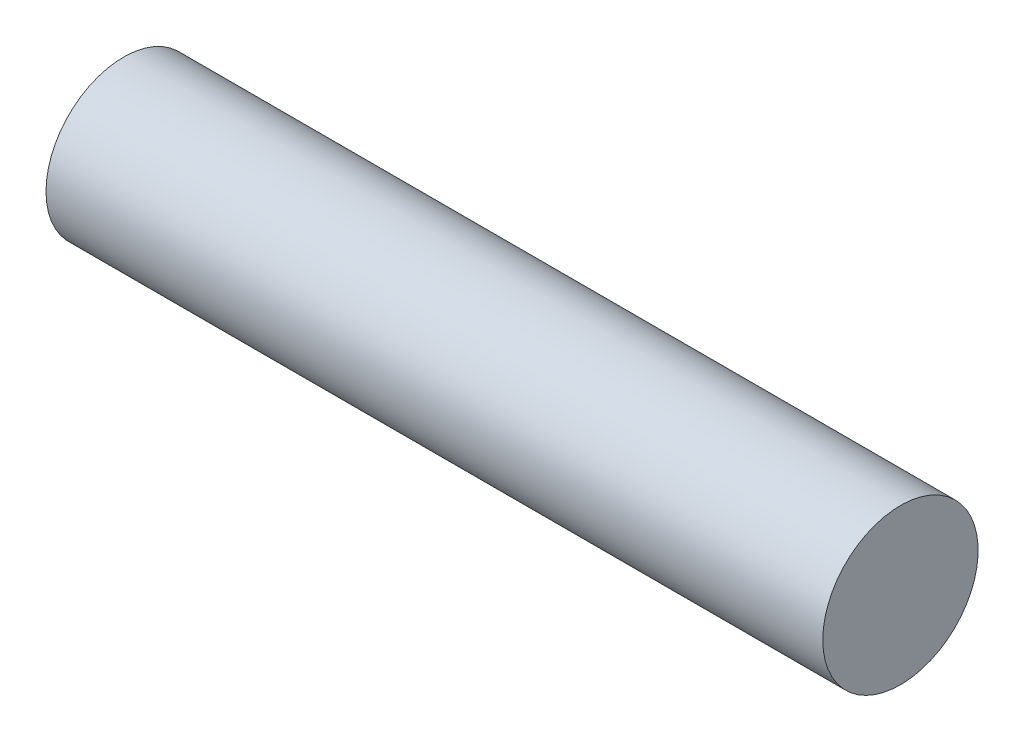
ISO-10303-21;
HEADER;
FILE_DESCRIPTION(('STEP AP214'),'2;1');
FILE_NAME('part.step','',(''),(''),'','','');
FILE_SCHEMA(('AUTOMOTIVE_DESIGN { 1 0 10303 214 1 1 1 1 }'));
ENDSEC;
DATA;
#1=APPLICATION_CONTEXT('core data for automotive mechanical design processes');
#2=APPLICATION_PROTOCOL_DEFINITION('international standard','automotive_design',2000,#1);
#3=PRODUCT_CONTEXT('',#1,'mechanical');
#4=PRODUCT('Part','Part','',(#3));
#5=PRODUCT_RELATED_PRODUCT_CATEGORY('part','',(#4));
#6=PRODUCT_DEFINITION_FORMATION('','',#4);
#7=PRODUCT_DEFINITION_CONTEXT('part definition',#1,'design');
#8=PRODUCT_DEFINITION('design','',#6,#7);
#9=PRODUCT_DEFINITION_SHAPE('','',#8);
#10=(LENGTH_UNIT() NAMED_UNIT(*) SI_UNIT(.MILLI.,.METRE.));
#11=(NAMED_UNIT(*) PLANE_ANGLE_UNIT() SI_UNIT($,.RADIAN.));
#12=(NAMED_UNIT(*) SI_UNIT($,.STERADIAN.) SOLID_ANGLE_UNIT());
#13=UNCERTAINTY_MEASURE_WITH_UNIT(LENGTH_MEASURE(1.E-05),#10,'distance_accuracy_value','');
#14=(GEOMETRIC_REPRESENTATION_CONTEXT(3) GLOBAL_UNCERTAINTY_ASSIGNED_CONTEXT((#13)) GLOBAL_UNIT_ASSIGNED_CONTEXT((#10,
#11,#12)) REPRESENTATION_CONTEXT('',''));
#15=CARTESIAN_POINT('',(0.,0.,0.));
#16=DIRECTION('',(0.,0.,1.));
#17=DIRECTION('',(1.,0.,0.));
#18=AXIS2_PLACEMENT_3D('',#15,#16,#17);
#19=CARTESIAN_POINT('',(-5.,0.,0.));
#20=DIRECTION('',(1.,0.,0.));
#21=DIRECTION('',(0.,0.,-1.));
#22=AXIS2_PLACEMENT_3D('',#19,#20,#21);
#23=PLANE('',#22);
#24=CARTESIAN_POINT('',(-5.,0.,0.));
#25=DIRECTION('',(-1.,0.,0.));
#26=DIRECTION('',(0.,0.,1.));
#27=AXIS2_PLACEMENT_3D('',#24,#25,#26);
#28=CIRCLE('',#27,0.5);
#29=CARTESIAN_POINT('',(-5.,0.,0.5));
#30=VERTEX_POINT('',#29);
#31=EDGE_CURVE('E10',#30,#30,#28,.T.);
#32=ORIENTED_EDGE('',*,*,#31,.T.);
#33=EDGE_LOOP('',(#32));
#34=FACE_BOUND('',#33,.T.);
#35=ADVANCED_FACE('F37',(#34),#23,.F.);
#36=CARTESIAN_POINT('',(-5.,0.,0.));
#37=DIRECTION('',(-1.,0.,0.));
#38=DIRECTION('',(0.,0.,1.));
#39=AXIS2_PLACEMENT_3D('',#36,#37,#38);
#40=CYLINDRICAL_SURFACE('',#39,0.5);
#41=ORIENTED_EDGE('',*,*,#31,.F.);
#42=EDGE_LOOP('',(#41));
#43=FACE_BOUND('',#42,.T.);
#44=CARTESIAN_POINT('',(0.,0.,0.));
#45=DIRECTION('',(-1.,0.,0.));
#46=DIRECTION('',(0.,0.,1.));
#47=AXIS2_PLACEMENT_3D('',#44,#45,#46);
#48=CIRCLE('',#47,0.5);
#49=CARTESIAN_POINT('',(0.,0.,0.5));
#50=VERTEX_POINT('',#49);
#51=EDGE_CURVE('E43',#50,#50,#48,.T.);
#52=ORIENTED_EDGE('',*,*,#51,.T.);
#53=EDGE_LOOP('',(#52));
#54=FACE_BOUND('',#53,.T.);
#55=ADVANCED_FACE('F49',(#43,#54),#40,.T.);
#56=CARTESIAN_POINT('',(0.,0.,0.));
#57=DIRECTION('',(-1.,0.,0.));
#58=DIRECTION('',(0.,0.,1.));
#59=AXIS2_PLACEMENT_3D('',#56,#57,#58);
#60=PLANE('',#59);
#61=ORIENTED_EDGE('',*,*,#51,.F.);
#62=EDGE_LOOP('',(#61));
#63=FACE_BOUND('',#62,.T.);
#64=ADVANCED_FACE('F51',(#63),#60,.F.);
#65=CLOSED_SHELL('',(#35,#55,#64));
#66=MANIFOLD_SOLID_BREP('B2',#65);
#67=ADVANCED_BREP_SHAPE_REPRESENTATION('',(#18,#66),#14);
#68=SHAPE_DEFINITION_REPRESENTATION(#9,#67);
ENDSEC;
END-ISO-10303-21;
